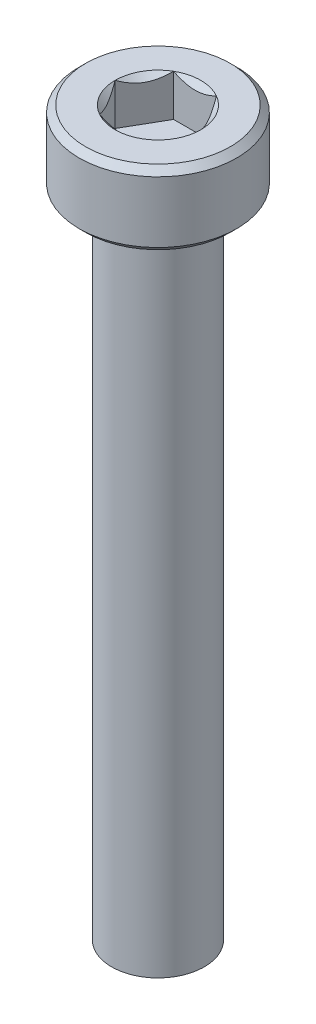
ISO-10303-21;
HEADER;
FILE_DESCRIPTION(('STEP AP214'),'2;1');
FILE_NAME('part.step','',(''),(''),'','','');
FILE_SCHEMA(('AUTOMOTIVE_DESIGN { 1 0 10303 214 1 1 1 1 }'));
ENDSEC;
DATA;
#1=APPLICATION_CONTEXT('core data for automotive mechanical design processes');
#2=APPLICATION_PROTOCOL_DEFINITION('international standard','automotive_design',2000,#1);
#3=PRODUCT_CONTEXT('',#1,'mechanical');
#4=PRODUCT('Part','Part','',(#3));
#5=PRODUCT_RELATED_PRODUCT_CATEGORY('part','',(#4));
#6=PRODUCT_DEFINITION_FORMATION('','',#4);
#7=PRODUCT_DEFINITION_CONTEXT('part definition',#1,'design');
#8=PRODUCT_DEFINITION('design','',#6,#7);
#9=PRODUCT_DEFINITION_SHAPE('','',#8);
#10=(LENGTH_UNIT() NAMED_UNIT(*) SI_UNIT(.MILLI.,.METRE.));
#11=(NAMED_UNIT(*) PLANE_ANGLE_UNIT() SI_UNIT($,.RADIAN.));
#12=(NAMED_UNIT(*) SI_UNIT($,.STERADIAN.) SOLID_ANGLE_UNIT());
#13=UNCERTAINTY_MEASURE_WITH_UNIT(LENGTH_MEASURE(1.E-05),#10,'distance_accuracy_value','');
#14=(GEOMETRIC_REPRESENTATION_CONTEXT(3) GLOBAL_UNCERTAINTY_ASSIGNED_CONTEXT((#13)) GLOBAL_UNIT_ASSIGNED_CONTEXT((#10,
#11,#12)) REPRESENTATION_CONTEXT('',''));
#15=CARTESIAN_POINT('',(0.,0.,0.));
#16=DIRECTION('',(0.,0.,1.));
#17=DIRECTION('',(1.,0.,0.));
#18=AXIS2_PLACEMENT_3D('',#15,#16,#17);
#19=CARTESIAN_POINT('',(0.,4.,0.));
#20=DIRECTION('',(0.,-1.,0.));
#21=DIRECTION('',(0.,0.,-1.));
#22=AXIS2_PLACEMENT_3D('',#19,#20,#21);
#23=CYLINDRICAL_SURFACE('',#22,4.25);
#24=CARTESIAN_POINT('',(0.,0.35,0.));
#25=DIRECTION('',(0.,1.,0.));
#26=DIRECTION('',(0.,0.,1.));
#27=AXIS2_PLACEMENT_3D('',#24,#25,#26);
#28=CIRCLE('',#27,4.25);
#29=CARTESIAN_POINT('',(0.,0.35,4.25));
#30=VERTEX_POINT('',#29);
#31=EDGE_CURVE('E191',#30,#30,#28,.T.);
#32=ORIENTED_EDGE('',*,*,#31,.T.);
#33=EDGE_LOOP('',(#32));
#34=FACE_BOUND('',#33,.T.);
#35=CARTESIAN_POINT('',(0.,3.65,0.));
#36=DIRECTION('',(0.,1.,0.));
#37=DIRECTION('',(0.,0.,1.));
#38=AXIS2_PLACEMENT_3D('',#35,#36,#37);
#39=CIRCLE('',#38,4.25);
#40=CARTESIAN_POINT('',(0.,3.65,4.25));
#41=VERTEX_POINT('',#40);
#42=EDGE_CURVE('E172',#41,#41,#39,.F.);
#43=ORIENTED_EDGE('',*,*,#42,.T.);
#44=EDGE_LOOP('',(#43));
#45=FACE_BOUND('',#44,.T.);
#46=ADVANCED_FACE('F33',(#34,#45),#23,.T.);
#47=CARTESIAN_POINT('',(0.,4.,0.));
#48=DIRECTION('',(0.,1.,0.));
#49=DIRECTION('',(0.,0.,1.));
#50=AXIS2_PLACEMENT_3D('',#47,#48,#49);
#51=PLANE('',#50);
#52=CARTESIAN_POINT('',(0.,4.,0.));
#53=DIRECTION('',(0.,1.,0.));
#54=DIRECTION('',(0.,0.,1.));
#55=AXIS2_PLACEMENT_3D('',#52,#53,#54);
#56=CIRCLE('',#55,3.9);
#57=CARTESIAN_POINT('',(0.,4.,3.9));
#58=VERTEX_POINT('',#57);
#59=EDGE_CURVE('E37',#58,#58,#56,.T.);
#60=ORIENTED_EDGE('',*,*,#59,.T.);
#61=EDGE_LOOP('',(#60));
#62=FACE_BOUND('',#61,.T.);
#63=CARTESIAN_POINT('',(0.,4.,0.));
#64=DIRECTION('',(0.,1.,0.));
#65=DIRECTION('',(0.,0.,1.));
#66=AXIS2_PLACEMENT_3D('',#63,#64,#65);
#67=CIRCLE('',#66,2.3094010767585);
#68=CARTESIAN_POINT('',(1.15470053837925,4.,2.));
#69=VERTEX_POINT('',#68);
#70=CARTESIAN_POINT('',(2.3094010767585,4.,0.));
#71=VERTEX_POINT('',#70);
#72=EDGE_CURVE('E48',#69,#71,#67,.T.);
#73=ORIENTED_EDGE('',*,*,#72,.F.);
#74=CARTESIAN_POINT('',(-1.15470053837925,4.,2.));
#75=VERTEX_POINT('',#74);
#76=EDGE_CURVE('E55',#75,#69,#67,.T.);
#77=ORIENTED_EDGE('',*,*,#76,.F.);
#78=CARTESIAN_POINT('',(-2.3094010767585,4.,0.));
#79=VERTEX_POINT('',#78);
#80=EDGE_CURVE('E220',#79,#75,#67,.T.);
#81=ORIENTED_EDGE('',*,*,#80,.F.);
#82=CARTESIAN_POINT('',(-1.15470053837925,4.,-2.));
#83=VERTEX_POINT('',#82);
#84=EDGE_CURVE('E270',#83,#79,#67,.T.);
#85=ORIENTED_EDGE('',*,*,#84,.F.);
#86=CARTESIAN_POINT('',(1.15470053837925,4.,-2.));
#87=VERTEX_POINT('',#86);
#88=EDGE_CURVE('E274',#87,#83,#67,.T.);
#89=ORIENTED_EDGE('',*,*,#88,.F.);
#90=EDGE_CURVE('E223',#71,#87,#67,.T.);
#91=ORIENTED_EDGE('',*,*,#90,.F.);
#92=EDGE_LOOP('',(#73,#77,#81,#85,#89,#91));
#93=FACE_BOUND('',#92,.T.);
#94=ADVANCED_FACE('F118',(#62,#93),#51,.T.);
#95=CARTESIAN_POINT('',(0.,0.,0.));
#96=DIRECTION('',(0.,1.,0.));
#97=DIRECTION('',(0.,0.,1.));
#98=AXIS2_PLACEMENT_3D('',#95,#96,#97);
#99=PLANE('',#98);
#100=CARTESIAN_POINT('',(0.,0.,0.));
#101=DIRECTION('',(0.,-1.,0.));
#102=DIRECTION('',(0.,0.,-1.));
#103=AXIS2_PLACEMENT_3D('',#100,#101,#102);
#104=CIRCLE('',#103,2.5);
#105=CARTESIAN_POINT('',(0.,0.,-2.5));
#106=VERTEX_POINT('',#105);
#107=EDGE_CURVE('E11',#106,#106,#104,.T.);
#108=ORIENTED_EDGE('',*,*,#107,.F.);
#109=EDGE_LOOP('',(#108));
#110=FACE_BOUND('',#109,.T.);
#111=CARTESIAN_POINT('',(0.,0.,0.));
#112=DIRECTION('',(0.,1.,0.));
#113=DIRECTION('',(0.,0.,1.));
#114=AXIS2_PLACEMENT_3D('',#111,#112,#113);
#115=CIRCLE('',#114,3.9);
#116=CARTESIAN_POINT('',(0.,0.,3.9));
#117=VERTEX_POINT('',#116);
#118=EDGE_CURVE('E192',#117,#117,#115,.F.);
#119=ORIENTED_EDGE('',*,*,#118,.T.);
#120=EDGE_LOOP('',(#119));
#121=FACE_BOUND('',#120,.T.);
#122=ADVANCED_FACE('F115',(#110,#121),#99,.F.);
#123=CARTESIAN_POINT('',(0.,4.,0.));
#124=DIRECTION('',(0.,1.,0.));
#125=DIRECTION('',(0.,0.,1.));
#126=AXIS2_PLACEMENT_3D('',#123,#124,#125);
#127=CONICAL_SURFACE('',#126,2.3094010767585,0.78539816339745);
#128=ORIENTED_EDGE('',*,*,#88,.T.);
#129=CARTESIAN_POINT('',(-2.30879514519547,4.7451913710941,-2.));
#130=CARTESIAN_POINT('',(-2.25260483420644,4.70272936243434,-2.));
#131=CARTESIAN_POINT('',(-2.19610054826954,4.66067688200341,-2.));
#132=CARTESIAN_POINT('',(-2.08233997644141,4.57757255324399,-2.));
#133=CARTESIAN_POINT('',(-2.02508350593089,4.53652095791472,-2.));
#134=CARTESIAN_POINT('',(-1.90927566541922,4.45530804643438,-2.));
#135=CARTESIAN_POINT('',(-1.85071770008489,4.41515609122241,-2.));
#136=CARTESIAN_POINT('',(-1.73260864093249,4.3363515847231,-2.));
#137=CARTESIAN_POINT('',(-1.67305761759535,4.29769892766731,-2.));
#138=CARTESIAN_POINT('',(-1.48577916730299,4.18010979954426,-2.));
#139=CARTESIAN_POINT('',(-1.35605368916015,4.10429897318513,-2.));
#140=CARTESIAN_POINT('',(-1.09012591699501,3.96558678933234,-2.));
#141=CARTESIAN_POINT('',(-0.953947448051695,3.90264190405374,-2.));
#142=CARTESIAN_POINT('',(-0.749595808101582,3.82563304479576,-2.));
#143=CARTESIAN_POINT('',(-0.68446185868507,3.80354078810321,-2.));
#144=CARTESIAN_POINT('',(-0.552616590705859,3.76458470124845,-2.));
#145=CARTESIAN_POINT('',(-0.485905164307167,3.74772122964342,-2.));
#146=CARTESIAN_POINT('',(-0.35242076182913,3.72038115809599,-2.));
#147=CARTESIAN_POINT('',(-0.285670630070522,3.70979477255778,-2.));
#148=CARTESIAN_POINT('',(-0.151450075115658,3.69521650264193,-2.));
#149=CARTESIAN_POINT('',(-0.0839797791079536,3.69122347258728,-2.));
#150=CARTESIAN_POINT('',(0.0485458836876959,3.69013056832569,-2.));
#151=CARTESIAN_POINT('',(0.113599297040325,3.69278385991794,-2.));
#152=CARTESIAN_POINT('',(0.243151501456514,3.7042913666304,-2.));
#153=CARTESIAN_POINT('',(0.307650238204749,3.71314618217543,-2.));
#154=CARTESIAN_POINT('',(0.436718068720302,3.73672255220297,-2.));
#155=CARTESIAN_POINT('',(0.501268607918767,3.75154414683371,-2.));
#156=CARTESIAN_POINT('',(0.62895874241765,3.78626456197787,-2.));
#157=CARTESIAN_POINT('',(0.692098453289582,3.80616296494129,-2.));
#158=CARTESIAN_POINT('',(0.890618825033236,3.87621951925558,-2.));
#159=CARTESIAN_POINT('',(1.02317938217928,3.9343452676672,-2.));
#160=CARTESIAN_POINT('',(1.28208571706617,4.06358808493712,-2.));
#161=CARTESIAN_POINT('',(1.40840705860453,4.1347517736225,-2.));
#162=CARTESIAN_POINT('',(1.59098608025607,4.245808104349,-2.));
#163=CARTESIAN_POINT('',(1.64922192266561,4.28251192905768,-2.));
#164=CARTESIAN_POINT('',(1.76469412690495,4.35747121364132,-2.));
#165=CARTESIAN_POINT('',(1.82193041260228,4.39572679097645,-2.));
#166=CARTESIAN_POINT('',(1.93507003138205,4.47318936346553,-2.));
#167=CARTESIAN_POINT('',(1.99098041312104,4.51238611495078,-2.));
#168=CARTESIAN_POINT('',(2.10203689890268,4.59181712257718,-2.));
#169=CARTESIAN_POINT('',(2.15718320893172,4.63205109038507,-2.));
#170=CARTESIAN_POINT('',(2.21200957179853,4.67270997847205,-2.));
#171=B_SPLINE_CURVE_WITH_KNOTS('',3,(#129,#130,#131,#132,#133,#134,#135,#136,#137,#138,#139,
#140,#141,#142,#143,#144,#145,#146,#147,#148,#149,#150,#151,#152,#153,#154,#155,#156,#157,#158,
#159,#160,#161,#162,#163,#164,#165,#166,#167,#168,#169,#170),.UNSPECIFIED.,.F.,.F.,(4,2,2,2,2,2,
2,2,2,2,2,2,2,2,2,2,2,2,2,2,4),(0.,0.211292968403538,0.422638804079875,0.635621962722851,
0.848590068976733,1.29896262331491,1.74778530247796,1.95394639565666,2.16012162294077,
2.36257550428405,2.56499420305935,2.76000764023076,2.95503996100237,3.15348829581996,
3.35192031420439,3.78488584147103,4.2194308621905,4.42592352930545,4.63243185619172,
4.83726388732872,5.04203957897375),.UNSPECIFIED.);
#172=EDGE_CURVE('E188',#87,#83,#171,.F.);
#173=ORIENTED_EDGE('',*,*,#172,.F.);
#174=EDGE_LOOP('',(#128,#173));
#175=FACE_BOUND('',#174,.T.);
#176=ADVANCED_FACE('F96',(#175),#127,.F.);
#177=ORIENTED_EDGE('',*,*,#84,.T.);
#178=CARTESIAN_POINT('',(-1.15458506832541,4.00011547871366,-2.0002));
#179=CARTESIAN_POINT('',(-1.19427965103065,3.96045309022559,-1.93144696596929));
#180=CARTESIAN_POINT('',(-1.23463799837204,3.92311998228416,-1.86154425786449));
#181=CARTESIAN_POINT('',(-1.31693321846145,3.85476368513614,-1.71900475544956));
#182=CARTESIAN_POINT('',(-1.35887791933134,3.82377853373722,-1.64635440243464));
#183=CARTESIAN_POINT('',(-1.44345742638069,3.77070021654414,-1.49985839894603));
#184=CARTESIAN_POINT('',(-1.48607068799507,3.74847362717661,-1.4260500647537));
#185=CARTESIAN_POINT('',(-1.57223542169503,3.71422881667508,-1.27680836816473));
#186=CARTESIAN_POINT('',(-1.61578426088223,3.70218502914413,-1.20137956608185));
#187=CARTESIAN_POINT('',(-1.69083694766536,3.69131851190557,-1.07138449932892));
#188=CARTESIAN_POINT('',(-1.72224381117151,3.68970975360997,-1.01698621602989));
#189=CARTESIAN_POINT('',(-1.78500621460364,3.69241887759871,-0.908278544480304));
#190=CARTESIAN_POINT('',(-1.81636173267754,3.69673883775797,-0.853969194078659));
#191=CARTESIAN_POINT('',(-1.87877671565355,3.71105956740991,-0.74586327241066));
#192=CARTESIAN_POINT('',(-1.90983580972306,3.72106669276201,-0.692067343445206));
#193=CARTESIAN_POINT('',(-1.97141691651548,3.74621243024966,-0.585405737694424));
#194=CARTESIAN_POINT('',(-2.00193897021859,3.76135064904224,-0.532539989929285));
#195=CARTESIAN_POINT('',(-2.08012358375727,3.80629450342919,-0.397120266910154));
#196=CARTESIAN_POINT('',(-2.12730124240478,3.83948883942582,-0.315406165150521));
#197=CARTESIAN_POINT('',(-2.19667172615922,3.89552582317137,-0.195252962742198));
#198=CARTESIAN_POINT('',(-2.21953238052245,3.91521470294694,-0.155657147890823));
#199=CARTESIAN_POINT('',(-2.26483018959123,3.95638731836487,-0.0771990411121286));
#200=CARTESIAN_POINT('',(-2.28726759416161,3.97786995165125,-0.0383363164062609));
#201=CARTESIAN_POINT('',(-2.30951654681234,4.00011547871366,0.000199999999998398));
#202=B_SPLINE_CURVE_WITH_KNOTS('',3,(#178,#179,#180,#181,#182,#183,#184,#185,#186,#187,#188,
#189,#190,#191,#192,#193,#194,#195,#196,#197,#198,#199,#200,#201),.UNSPECIFIED.,.F.,.F.,(4,2,2,
2,2,2,2,2,2,2,2,4),(0.,0.266420613771064,0.534393751523389,0.798110374376916,1.06116288956937,
1.24939906803722,1.43770123566248,1.62621426093932,1.81471283831913,2.11415604834145,
2.2634717071779,2.4126962696977),.UNSPECIFIED.);
#203=EDGE_CURVE('E229',#83,#79,#202,.T.);
#204=ORIENTED_EDGE('',*,*,#203,.F.);
#205=EDGE_LOOP('',(#177,#204));
#206=FACE_BOUND('',#205,.T.);
#207=ADVANCED_FACE('F114',(#206),#127,.F.);
#208=ORIENTED_EDGE('',*,*,#80,.T.);
#209=CARTESIAN_POINT('',(-2.30951654681234,4.00011547871366,-0.000200000000001262));
#210=CARTESIAN_POINT('',(-2.26982196410711,3.96045309022559,0.0685530340307045));
#211=CARTESIAN_POINT('',(-2.22946361676572,3.92311998228416,0.138455742135511));
#212=CARTESIAN_POINT('',(-2.1471683966763,3.85476368513614,0.280995244550435));
#213=CARTESIAN_POINT('',(-2.10522369580642,3.82377853373722,0.353645597565357));
#214=CARTESIAN_POINT('',(-2.02064418875706,3.77070021654414,0.50014160105397));
#215=CARTESIAN_POINT('',(-1.97803092714269,3.74847362717661,0.573949935246294));
#216=CARTESIAN_POINT('',(-1.89186619344273,3.71422881667508,0.723191631835263));
#217=CARTESIAN_POINT('',(-1.84831735425552,3.70218502914413,0.798620433918151));
#218=CARTESIAN_POINT('',(-1.7732646674724,3.69131851190557,0.928615500671078));
#219=CARTESIAN_POINT('',(-1.74185780396625,3.68970975360997,0.983013783970107));
#220=CARTESIAN_POINT('',(-1.67909540053412,3.69241887759871,1.09172145551969));
#221=CARTESIAN_POINT('',(-1.64773988246021,3.69673883775797,1.14603080592134));
#222=CARTESIAN_POINT('',(-1.5853248994842,3.7110595674099,1.25413672758934));
#223=CARTESIAN_POINT('',(-1.55426580541469,3.721066692762,1.30793265655479));
#224=CARTESIAN_POINT('',(-1.49268469862228,3.74621243024966,1.41459426230557));
#225=CARTESIAN_POINT('',(-1.46216264491917,3.76135064904224,1.46746001007071));
#226=CARTESIAN_POINT('',(-1.38397803138049,3.80629450342919,1.60287973308984));
#227=CARTESIAN_POINT('',(-1.33680037273297,3.83948883942582,1.68459383484948));
#228=CARTESIAN_POINT('',(-1.26742988897853,3.89552582317137,1.8047470372578));
#229=CARTESIAN_POINT('',(-1.24456923461531,3.91521470294694,1.84434285210918));
#230=CARTESIAN_POINT('',(-1.19927142554652,3.95638731836487,1.92280095888787));
#231=CARTESIAN_POINT('',(-1.17683402097614,3.97786995165125,1.96166368359374));
#232=CARTESIAN_POINT('',(-1.15458506832541,4.00011547871366,2.0002));
#233=B_SPLINE_CURVE_WITH_KNOTS('',3,(#209,#210,#211,#212,#213,#214,#215,#216,#217,#218,#219,
#220,#221,#222,#223,#224,#225,#226,#227,#228,#229,#230,#231,#232),.UNSPECIFIED.,.F.,.F.,(4,2,2,
2,2,2,2,2,2,2,2,4),(0.,0.266420613771064,0.534393751523389,0.798110374376915,1.06116288956936,
1.24939906803722,1.43770123566247,1.62621426093932,1.81471283831913,2.11415604834145,
2.26347170717791,2.41269626969771),.UNSPECIFIED.);
#234=EDGE_CURVE('E235',#79,#75,#233,.T.);
#235=ORIENTED_EDGE('',*,*,#234,.F.);
#236=EDGE_LOOP('',(#208,#235));
#237=FACE_BOUND('',#236,.T.);
#238=ADVANCED_FACE('F268',(#237),#127,.F.);
#239=ORIENTED_EDGE('',*,*,#76,.T.);
#240=CARTESIAN_POINT('',(-2.30879514519547,4.7451913710941,2.));
#241=CARTESIAN_POINT('',(-2.25260483420644,4.70272936243434,2.));
#242=CARTESIAN_POINT('',(-2.19610054826953,4.66067688200341,2.));
#243=CARTESIAN_POINT('',(-2.0823399764414,4.57757255324399,2.));
#244=CARTESIAN_POINT('',(-2.02508350593089,4.53652095791471,2.));
#245=CARTESIAN_POINT('',(-1.90927566541922,4.45530804643438,2.));
#246=CARTESIAN_POINT('',(-1.85071770008489,4.41515609122241,2.));
#247=CARTESIAN_POINT('',(-1.73260864093249,4.3363515847231,2.));
#248=CARTESIAN_POINT('',(-1.67305761759535,4.29769892766731,2.));
#249=CARTESIAN_POINT('',(-1.48577916730299,4.18010979954426,2.));
#250=CARTESIAN_POINT('',(-1.35605368916015,4.10429897318513,2.));
#251=CARTESIAN_POINT('',(-1.09012591699501,3.96558678933234,2.));
#252=CARTESIAN_POINT('',(-0.953947448051694,3.90264190405374,2.));
#253=CARTESIAN_POINT('',(-0.749595808101582,3.82563304479576,2.));
#254=CARTESIAN_POINT('',(-0.68446185868507,3.80354078810321,2.));
#255=CARTESIAN_POINT('',(-0.552616590705859,3.76458470124845,2.));
#256=CARTESIAN_POINT('',(-0.485905164307167,3.74772122964342,2.));
#257=CARTESIAN_POINT('',(-0.352420761829129,3.72038115809599,2.));
#258=CARTESIAN_POINT('',(-0.285670630070522,3.70979477255778,2.));
#259=CARTESIAN_POINT('',(-0.151450075115657,3.69521650264193,2.));
#260=CARTESIAN_POINT('',(-0.0839797791079529,3.69122347258728,2.));
#261=CARTESIAN_POINT('',(0.0485458836876966,3.69013056832569,2.));
#262=CARTESIAN_POINT('',(0.113599297040325,3.69278385991794,2.));
#263=CARTESIAN_POINT('',(0.243151501456515,3.7042913666304,2.));
#264=CARTESIAN_POINT('',(0.307650238204749,3.71314618217543,2.));
#265=CARTESIAN_POINT('',(0.436718068720302,3.73672255220297,2.));
#266=CARTESIAN_POINT('',(0.501268607918768,3.75154414683371,2.));
#267=CARTESIAN_POINT('',(0.62895874241765,3.78626456197787,2.));
#268=CARTESIAN_POINT('',(0.692098453289583,3.80616296494129,2.));
#269=CARTESIAN_POINT('',(0.890618825033236,3.87621951925558,2.));
#270=CARTESIAN_POINT('',(1.02317938217928,3.9343452676672,2.));
#271=CARTESIAN_POINT('',(1.28208571706617,4.06358808493712,2.));
#272=CARTESIAN_POINT('',(1.40840705860453,4.1347517736225,2.));
#273=CARTESIAN_POINT('',(1.59098608025607,4.24580810434899,2.));
#274=CARTESIAN_POINT('',(1.64922192266561,4.28251192905768,2.));
#275=CARTESIAN_POINT('',(1.76469412690495,4.35747121364132,2.));
#276=CARTESIAN_POINT('',(1.82193041260228,4.39572679097644,2.));
#277=CARTESIAN_POINT('',(1.93507003138205,4.47318936346553,2.));
#278=CARTESIAN_POINT('',(1.99098041312104,4.51238611495078,2.));
#279=CARTESIAN_POINT('',(2.10203689890268,4.59181712257718,2.));
#280=CARTESIAN_POINT('',(2.15718320893172,4.63205109038507,2.));
#281=CARTESIAN_POINT('',(2.21200957179853,4.67270997847205,2.));
#282=B_SPLINE_CURVE_WITH_KNOTS('',3,(#240,#241,#242,#243,#244,#245,#246,#247,#248,#249,#250,
#251,#252,#253,#254,#255,#256,#257,#258,#259,#260,#261,#262,#263,#264,#265,#266,#267,#268,#269,
#270,#271,#272,#273,#274,#275,#276,#277,#278,#279,#280,#281),.UNSPECIFIED.,.F.,.F.,(4,2,2,2,2,2,
2,2,2,2,2,2,2,2,2,2,2,2,2,2,4),(0.,0.211292968403538,0.422638804079876,0.63562196272285,
0.848590068976733,1.29896262331491,1.74778530247796,1.95394639565666,2.16012162294077,
2.36257550428405,2.56499420305935,2.76000764023076,2.95503996100237,3.15348829581996,
3.35192031420438,3.78488584147103,4.2194308621905,4.42592352930545,4.63243185619172,
4.83726388732871,5.04203957897375),.UNSPECIFIED.);
#283=EDGE_CURVE('E254',#75,#69,#282,.T.);
#284=ORIENTED_EDGE('',*,*,#283,.F.);
#285=EDGE_LOOP('',(#239,#284));
#286=FACE_BOUND('',#285,.T.);
#287=ADVANCED_FACE('F267',(#286),#127,.F.);
#288=ORIENTED_EDGE('',*,*,#72,.T.);
#289=CARTESIAN_POINT('',(1.15458506832541,4.00011547871366,2.0002));
#290=CARTESIAN_POINT('',(1.19427965103064,3.96045309022559,1.93144696596929));
#291=CARTESIAN_POINT('',(1.23463799837204,3.92311998228416,1.86154425786449));
#292=CARTESIAN_POINT('',(1.31693321846145,3.85476368513614,1.71900475544956));
#293=CARTESIAN_POINT('',(1.35887791933134,3.82377853373722,1.64635440243464));
#294=CARTESIAN_POINT('',(1.44345742638069,3.77070021654414,1.49985839894603));
#295=CARTESIAN_POINT('',(1.48607068799507,3.74847362717661,1.42605006475371));
#296=CARTESIAN_POINT('',(1.57223542169503,3.71422881667508,1.27680836816474));
#297=CARTESIAN_POINT('',(1.61578426088223,3.70218502914413,1.20137956608185));
#298=CARTESIAN_POINT('',(1.69083694766536,3.69131851190557,1.07138449932892));
#299=CARTESIAN_POINT('',(1.72224381117151,3.68970975360997,1.01698621602989));
#300=CARTESIAN_POINT('',(1.78500621460364,3.69241887759871,0.908278544480306));
#301=CARTESIAN_POINT('',(1.81636173267754,3.69673883775797,0.85396919407866));
#302=CARTESIAN_POINT('',(1.87877671565355,3.71105956740991,0.745863272410661));
#303=CARTESIAN_POINT('',(1.90983580972306,3.72106669276201,0.692067343445207));
#304=CARTESIAN_POINT('',(1.97141691651548,3.74621243024966,0.585405737694425));
#305=CARTESIAN_POINT('',(2.00193897021859,3.76135064904224,0.532539989929286));
#306=CARTESIAN_POINT('',(2.08012358375727,3.80629450342919,0.397120266910155));
#307=CARTESIAN_POINT('',(2.12730124240478,3.83948883942582,0.315406165150521));
#308=CARTESIAN_POINT('',(2.19667172615922,3.89552582317137,0.195252962742197));
#309=CARTESIAN_POINT('',(2.21953238052245,3.91521470294694,0.155657147890823));
#310=CARTESIAN_POINT('',(2.26483018959124,3.95638731836487,0.0771990411121278));
#311=CARTESIAN_POINT('',(2.28726759416161,3.97786995165125,0.0383363164062597));
#312=CARTESIAN_POINT('',(2.30951654681234,4.00011547871366,-0.000200000000000139));
#313=B_SPLINE_CURVE_WITH_KNOTS('',3,(#289,#290,#291,#292,#293,#294,#295,#296,#297,#298,#299,
#300,#301,#302,#303,#304,#305,#306,#307,#308,#309,#310,#311,#312),.UNSPECIFIED.,.F.,.F.,(4,2,2,
2,2,2,2,2,2,2,2,4),(0.,0.266420613771064,0.534393751523389,0.798110374376915,1.06116288956936,
1.24939906803722,1.43770123566248,1.62621426093932,1.81471283831913,2.11415604834145,
2.2634717071779,2.41269626969771),.UNSPECIFIED.);
#314=EDGE_CURVE('E145',#69,#71,#313,.T.);
#315=ORIENTED_EDGE('',*,*,#314,.F.);
#316=EDGE_LOOP('',(#288,#315));
#317=FACE_BOUND('',#316,.T.);
#318=ADVANCED_FACE('F111',(#317),#127,.F.);
#319=ORIENTED_EDGE('',*,*,#90,.T.);
#320=CARTESIAN_POINT('',(2.30951654681234,4.00011547871366,0.000199999999999522));
#321=CARTESIAN_POINT('',(2.26982196410711,3.96045309022559,-0.0685530340307061));
#322=CARTESIAN_POINT('',(2.22946361676572,3.92311998228416,-0.138455742135512));
#323=CARTESIAN_POINT('',(2.1471683966763,3.85476368513614,-0.280995244550437));
#324=CARTESIAN_POINT('',(2.10522369580642,3.82377853373722,-0.353645597565359));
#325=CARTESIAN_POINT('',(2.02064418875706,3.77070021654414,-0.500141601053972));
#326=CARTESIAN_POINT('',(1.97803092714269,3.74847362717661,-0.573949935246295));
#327=CARTESIAN_POINT('',(1.89186619344273,3.71422881667508,-0.723191631835264));
#328=CARTESIAN_POINT('',(1.84831735425552,3.70218502914413,-0.798620433918152));
#329=CARTESIAN_POINT('',(1.7732646674724,3.69131851190557,-0.928615500671079));
#330=CARTESIAN_POINT('',(1.74185780396625,3.68970975360997,-0.983013783970109));
#331=CARTESIAN_POINT('',(1.67909540053412,3.69241887759871,-1.09172145551969));
#332=CARTESIAN_POINT('',(1.64773988246021,3.69673883775797,-1.14603080592134));
#333=CARTESIAN_POINT('',(1.5853248994842,3.71105956740991,-1.25413672758934));
#334=CARTESIAN_POINT('',(1.55426580541469,3.72106669276201,-1.30793265655479));
#335=CARTESIAN_POINT('',(1.49268469862228,3.74621243024966,-1.41459426230557));
#336=CARTESIAN_POINT('',(1.46216264491917,3.76135064904224,-1.46746001007071));
#337=CARTESIAN_POINT('',(1.38397803138049,3.80629450342919,-1.60287973308984));
#338=CARTESIAN_POINT('',(1.33680037273297,3.83948883942582,-1.68459383484948));
#339=CARTESIAN_POINT('',(1.26742988897853,3.89552582317137,-1.8047470372578));
#340=CARTESIAN_POINT('',(1.24456923461531,3.91521470294694,-1.84434285210918));
#341=CARTESIAN_POINT('',(1.19927142554652,3.95638731836487,-1.92280095888787));
#342=CARTESIAN_POINT('',(1.17683402097614,3.97786995165125,-1.96166368359374));
#343=CARTESIAN_POINT('',(1.15458506832541,4.00011547871366,-2.0002));
#344=B_SPLINE_CURVE_WITH_KNOTS('',3,(#320,#321,#322,#323,#324,#325,#326,#327,#328,#329,#330,
#331,#332,#333,#334,#335,#336,#337,#338,#339,#340,#341,#342,#343),.UNSPECIFIED.,.F.,.F.,(4,2,2,
2,2,2,2,2,2,2,2,4),(0.,0.266420613771064,0.534393751523388,0.798110374376914,1.06116288956936,
1.24939906803722,1.43770123566247,1.62621426093932,1.81471283831913,2.11415604834145,
2.2634717071779,2.41269626969771),.UNSPECIFIED.);
#345=EDGE_CURVE('E137',#71,#87,#344,.T.);
#346=ORIENTED_EDGE('',*,*,#345,.F.);
#347=EDGE_LOOP('',(#319,#346));
#348=FACE_BOUND('',#347,.T.);
#349=ADVANCED_FACE('F95',(#348),#127,.F.);
#350=CARTESIAN_POINT('',(0.,1.75,0.));
#351=DIRECTION('',(0.,1.,0.));
#352=DIRECTION('',(0.,0.,1.));
#353=AXIS2_PLACEMENT_3D('',#350,#351,#352);
#354=PLANE('',#353);
#355=CARTESIAN_POINT('',(0.,1.75,0.));
#356=DIRECTION('',(0.,1.,0.));
#357=DIRECTION('',(0.,0.,1.));
#358=AXIS2_PLACEMENT_3D('',#355,#356,#357);
#359=CIRCLE('',#358,0.059401076758495);
#360=CARTESIAN_POINT('',(0.,1.75,0.059401076758495));
#361=VERTEX_POINT('',#360);
#362=EDGE_CURVE('E186',#361,#361,#359,.T.);
#363=ORIENTED_EDGE('',*,*,#362,.F.);
#364=EDGE_LOOP('',(#363));
#365=FACE_BOUND('',#364,.T.);
#366=DIRECTION('',(-0.5,0.,-0.866025403784439));
#367=VECTOR('',#366,1.);
#368=CARTESIAN_POINT('',(2.3094010767585,1.75,0.));
#369=LINE('',#368,#367);
#370=CARTESIAN_POINT('',(2.3094010767585,1.75,0.));
#371=VERTEX_POINT('',#370);
#372=CARTESIAN_POINT('',(1.15470053837925,1.75,-2.));
#373=VERTEX_POINT('',#372);
#374=EDGE_CURVE('E144',#371,#373,#369,.T.);
#375=ORIENTED_EDGE('',*,*,#374,.T.);
#376=DIRECTION('',(-1.,0.,0.));
#377=VECTOR('',#376,1.);
#378=CARTESIAN_POINT('',(1.15470053837925,1.75,-2.));
#379=LINE('',#378,#377);
#380=CARTESIAN_POINT('',(-1.15470053837925,1.75,-2.));
#381=VERTEX_POINT('',#380);
#382=EDGE_CURVE('E153',#373,#381,#379,.T.);
#383=ORIENTED_EDGE('',*,*,#382,.T.);
#384=DIRECTION('',(-0.5,0.,0.866025403784439));
#385=VECTOR('',#384,1.);
#386=CARTESIAN_POINT('',(-1.15470053837925,1.75,-2.));
#387=LINE('',#386,#385);
#388=CARTESIAN_POINT('',(-2.3094010767585,1.75,0.));
#389=VERTEX_POINT('',#388);
#390=EDGE_CURVE('E156',#381,#389,#387,.T.);
#391=ORIENTED_EDGE('',*,*,#390,.T.);
#392=DIRECTION('',(0.5,0.,0.866025403784439));
#393=VECTOR('',#392,1.);
#394=CARTESIAN_POINT('',(-2.3094010767585,1.75,0.));
#395=LINE('',#394,#393);
#396=CARTESIAN_POINT('',(-1.15470053837925,1.75,2.));
#397=VERTEX_POINT('',#396);
#398=EDGE_CURVE('E159',#389,#397,#395,.T.);
#399=ORIENTED_EDGE('',*,*,#398,.T.);
#400=DIRECTION('',(1.,0.,0.));
#401=VECTOR('',#400,1.);
#402=CARTESIAN_POINT('',(-1.15470053837925,1.75,2.));
#403=LINE('',#402,#401);
#404=CARTESIAN_POINT('',(1.15470053837925,1.75,2.));
#405=VERTEX_POINT('',#404);
#406=EDGE_CURVE('E162',#397,#405,#403,.T.);
#407=ORIENTED_EDGE('',*,*,#406,.T.);
#408=DIRECTION('',(0.5,0.,-0.866025403784439));
#409=VECTOR('',#408,1.);
#410=CARTESIAN_POINT('',(1.15470053837925,1.75,2.));
#411=LINE('',#410,#409);
#412=EDGE_CURVE('E165',#405,#371,#411,.T.);
#413=ORIENTED_EDGE('',*,*,#412,.T.);
#414=EDGE_LOOP('',(#375,#383,#391,#399,#407,#413));
#415=FACE_BOUND('',#414,.T.);
#416=ADVANCED_FACE('F110',(#365,#415),#354,.T.);
#417=CARTESIAN_POINT('',(1.15470053837925,1.75,-2.));
#418=DIRECTION('',(0.,0.,-1.));
#419=DIRECTION('',(-1.,0.,0.));
#420=AXIS2_PLACEMENT_3D('',#417,#418,#419);
#421=PLANE('',#420);
#422=DIRECTION('',(0.,1.,0.));
#423=VECTOR('',#422,1.);
#424=CARTESIAN_POINT('',(1.15470053837925,1.75,-2.));
#425=LINE('',#424,#423);
#426=EDGE_CURVE('E168',#373,#87,#425,.T.);
#427=ORIENTED_EDGE('',*,*,#426,.T.);
#428=ORIENTED_EDGE('',*,*,#172,.T.);
#429=DIRECTION('',(0.,1.,0.));
#430=VECTOR('',#429,1.);
#431=CARTESIAN_POINT('',(-1.15470053837925,1.75,-2.));
#432=LINE('',#431,#430);
#433=EDGE_CURVE('E181',#381,#83,#432,.T.);
#434=ORIENTED_EDGE('',*,*,#433,.F.);
#435=ORIENTED_EDGE('',*,*,#382,.F.);
#436=EDGE_LOOP('',(#427,#428,#434,#435));
#437=FACE_BOUND('',#436,.T.);
#438=ADVANCED_FACE('F133',(#437),#421,.F.);
#439=CARTESIAN_POINT('',(-1.15470053837925,1.75,-2.));
#440=DIRECTION('',(-0.866025403784439,0.,-0.5));
#441=DIRECTION('',(-0.5,0.,0.866025403784439));
#442=AXIS2_PLACEMENT_3D('',#439,#440,#441);
#443=PLANE('',#442);
#444=ORIENTED_EDGE('',*,*,#433,.T.);
#445=ORIENTED_EDGE('',*,*,#203,.T.);
#446=DIRECTION('',(0.,1.,0.));
#447=VECTOR('',#446,1.);
#448=CARTESIAN_POINT('',(-2.3094010767585,1.75,0.));
#449=LINE('',#448,#447);
#450=EDGE_CURVE('E178',#389,#79,#449,.T.);
#451=ORIENTED_EDGE('',*,*,#450,.F.);
#452=ORIENTED_EDGE('',*,*,#390,.F.);
#453=EDGE_LOOP('',(#444,#445,#451,#452));
#454=FACE_BOUND('',#453,.T.);
#455=ADVANCED_FACE('F240',(#454),#443,.F.);
#456=CARTESIAN_POINT('',(-2.3094010767585,1.75,0.));
#457=DIRECTION('',(-0.866025403784439,0.,0.5));
#458=DIRECTION('',(0.5,0.,0.866025403784439));
#459=AXIS2_PLACEMENT_3D('',#456,#457,#458);
#460=PLANE('',#459);
#461=ORIENTED_EDGE('',*,*,#450,.T.);
#462=ORIENTED_EDGE('',*,*,#234,.T.);
#463=DIRECTION('',(0.,1.,0.));
#464=VECTOR('',#463,1.);
#465=CARTESIAN_POINT('',(-1.15470053837925,1.75,2.));
#466=LINE('',#465,#464);
#467=EDGE_CURVE('E176',#397,#75,#466,.T.);
#468=ORIENTED_EDGE('',*,*,#467,.F.);
#469=ORIENTED_EDGE('',*,*,#398,.F.);
#470=EDGE_LOOP('',(#461,#462,#468,#469));
#471=FACE_BOUND('',#470,.T.);
#472=ADVANCED_FACE('F243',(#471),#460,.F.);
#473=CARTESIAN_POINT('',(-1.15470053837925,1.75,2.));
#474=DIRECTION('',(0.,0.,1.));
#475=DIRECTION('',(1.,0.,0.));
#476=AXIS2_PLACEMENT_3D('',#473,#474,#475);
#477=PLANE('',#476);
#478=ORIENTED_EDGE('',*,*,#467,.T.);
#479=ORIENTED_EDGE('',*,*,#283,.T.);
#480=DIRECTION('',(0.,1.,0.));
#481=VECTOR('',#480,1.);
#482=CARTESIAN_POINT('',(1.15470053837925,1.75,2.));
#483=LINE('',#482,#481);
#484=EDGE_CURVE('E173',#405,#69,#483,.T.);
#485=ORIENTED_EDGE('',*,*,#484,.F.);
#486=ORIENTED_EDGE('',*,*,#406,.F.);
#487=EDGE_LOOP('',(#478,#479,#485,#486));
#488=FACE_BOUND('',#487,.T.);
#489=ADVANCED_FACE('F248',(#488),#477,.F.);
#490=CARTESIAN_POINT('',(1.15470053837925,1.75,2.));
#491=DIRECTION('',(0.866025403784439,0.,0.5));
#492=DIRECTION('',(0.5,0.,-0.866025403784439));
#493=AXIS2_PLACEMENT_3D('',#490,#491,#492);
#494=PLANE('',#493);
#495=ORIENTED_EDGE('',*,*,#484,.T.);
#496=ORIENTED_EDGE('',*,*,#314,.T.);
#497=DIRECTION('',(0.,1.,0.));
#498=VECTOR('',#497,1.);
#499=CARTESIAN_POINT('',(2.3094010767585,1.75,0.));
#500=LINE('',#499,#498);
#501=EDGE_CURVE('E169',#371,#71,#500,.T.);
#502=ORIENTED_EDGE('',*,*,#501,.F.);
#503=ORIENTED_EDGE('',*,*,#412,.F.);
#504=EDGE_LOOP('',(#495,#496,#502,#503));
#505=FACE_BOUND('',#504,.T.);
#506=ADVANCED_FACE('F102',(#505),#494,.F.);
#507=CARTESIAN_POINT('',(2.3094010767585,1.75,0.));
#508=DIRECTION('',(0.866025403784439,0.,-0.5));
#509=DIRECTION('',(-0.5,0.,-0.866025403784439));
#510=AXIS2_PLACEMENT_3D('',#507,#508,#509);
#511=PLANE('',#510);
#512=ORIENTED_EDGE('',*,*,#501,.T.);
#513=ORIENTED_EDGE('',*,*,#345,.T.);
#514=ORIENTED_EDGE('',*,*,#426,.F.);
#515=ORIENTED_EDGE('',*,*,#374,.F.);
#516=EDGE_LOOP('',(#512,#513,#514,#515));
#517=FACE_BOUND('',#516,.T.);
#518=ADVANCED_FACE('F92',(#517),#511,.F.);
#519=ORIENTED_EDGE('',*,*,#362,.T.);
#520=EDGE_LOOP('',(#519));
#521=FACE_BOUND('',#520,.T.);
#522=CARTESIAN_POINT('',(0.,1.69059892324151,0.));
#523=VERTEX_POINT('',#522);
#524=VERTEX_LOOP('',#523);
#525=FACE_BOUND('',#524,.T.);
#526=ADVANCED_FACE('F89',(#521,#525),#127,.F.);
#527=CARTESIAN_POINT('',(0.,0.35,0.));
#528=DIRECTION('',(0.,1.,0.));
#529=DIRECTION('',(0.,0.,1.));
#530=AXIS2_PLACEMENT_3D('',#527,#528,#529);
#531=CONICAL_SURFACE('',#530,4.25,0.78539816339745);
#532=CARTESIAN_POINT('',(0.,0.,3.9));
#533=CARTESIAN_POINT('',(0.,0.00364583333333348,3.90364583333333));
#534=CARTESIAN_POINT('',(0.,0.00729166666666674,3.90729166666667));
#535=CARTESIAN_POINT('',(0.,0.0145833333333333,3.91458333333333));
#536=CARTESIAN_POINT('',(0.,0.0182291666666665,3.91822916666667));
#537=CARTESIAN_POINT('',(0.,0.0255208333333332,3.92552083333333));
#538=CARTESIAN_POINT('',(0.,0.0291666666666665,3.92916666666667));
#539=CARTESIAN_POINT('',(0.,0.0364583333333333,3.93645833333333));
#540=CARTESIAN_POINT('',(0.,0.0401041666666667,3.94010416666667));
#541=CARTESIAN_POINT('',(0.,0.0473958333333333,3.94739583333333));
#542=CARTESIAN_POINT('',(0.,0.0510416666666665,3.95104166666667));
#543=CARTESIAN_POINT('',(0.,0.0583333333333331,3.95833333333333));
#544=CARTESIAN_POINT('',(0.,0.0619791666666666,3.96197916666667));
#545=CARTESIAN_POINT('',(0.,0.0692708333333333,3.96927083333333));
#546=CARTESIAN_POINT('',(0.,0.0729166666666665,3.97291666666667));
#547=CARTESIAN_POINT('',(0.,0.0802083333333331,3.98020833333333));
#548=CARTESIAN_POINT('',(0.,0.0838541666666666,3.98385416666667));
#549=CARTESIAN_POINT('',(0.,0.0911458333333333,3.99114583333333));
#550=CARTESIAN_POINT('',(0.,0.0947916666666665,3.99479166666667));
#551=CARTESIAN_POINT('',(0.,0.102083333333333,4.00208333333333));
#552=CARTESIAN_POINT('',(0.,0.105729166666666,4.00572916666667));
#553=CARTESIAN_POINT('',(0.,0.113020833333333,4.01302083333333));
#554=CARTESIAN_POINT('',(0.,0.116666666666667,4.01666666666667));
#555=CARTESIAN_POINT('',(0.,0.123958333333333,4.02395833333333));
#556=CARTESIAN_POINT('',(0.,0.127604166666666,4.02760416666667));
#557=CARTESIAN_POINT('',(0.,0.134895833333333,4.03489583333333));
#558=CARTESIAN_POINT('',(0.,0.138541666666667,4.03854166666667));
#559=CARTESIAN_POINT('',(0.,0.145833333333333,4.04583333333333));
#560=CARTESIAN_POINT('',(0.,0.149479166666666,4.04947916666667));
#561=CARTESIAN_POINT('',(0.,0.156770833333333,4.05677083333333));
#562=CARTESIAN_POINT('',(0.,0.160416666666666,4.06041666666667));
#563=CARTESIAN_POINT('',(0.,0.167708333333333,4.06770833333333));
#564=CARTESIAN_POINT('',(0.,0.171354166666667,4.07135416666667));
#565=CARTESIAN_POINT('',(0.,0.178645833333333,4.07864583333333));
#566=CARTESIAN_POINT('',(0.,0.182291666666666,4.08229166666667));
#567=CARTESIAN_POINT('',(0.,0.189583333333333,4.08958333333333));
#568=CARTESIAN_POINT('',(0.,0.193229166666666,4.09322916666667));
#569=CARTESIAN_POINT('',(0.,0.200520833333333,4.10052083333333));
#570=CARTESIAN_POINT('',(0.,0.204166666666666,4.10416666666667));
#571=CARTESIAN_POINT('',(0.,0.211458333333333,4.11145833333333));
#572=CARTESIAN_POINT('',(0.,0.215104166666666,4.11510416666667));
#573=CARTESIAN_POINT('',(0.,0.222395833333333,4.12239583333333));
#574=CARTESIAN_POINT('',(0.,0.226041666666666,4.12604166666667));
#575=CARTESIAN_POINT('',(0.,0.233333333333333,4.13333333333333));
#576=CARTESIAN_POINT('',(0.,0.236979166666666,4.13697916666667));
#577=CARTESIAN_POINT('',(0.,0.244270833333333,4.14427083333333));
#578=CARTESIAN_POINT('',(0.,0.247916666666666,4.14791666666667));
#579=CARTESIAN_POINT('',(0.,0.255208333333333,4.15520833333333));
#580=CARTESIAN_POINT('',(0.,0.258854166666666,4.15885416666667));
#581=CARTESIAN_POINT('',(0.,0.266145833333333,4.16614583333333));
#582=CARTESIAN_POINT('',(0.,0.269791666666666,4.16979166666667));
#583=CARTESIAN_POINT('',(0.,0.277083333333333,4.17708333333333));
#584=CARTESIAN_POINT('',(0.,0.280729166666666,4.18072916666667));
#585=CARTESIAN_POINT('',(0.,0.288020833333333,4.18802083333333));
#586=CARTESIAN_POINT('',(0.,0.291666666666666,4.19166666666667));
#587=CARTESIAN_POINT('',(0.,0.298958333333333,4.19895833333333));
#588=CARTESIAN_POINT('',(0.,0.302604166666666,4.20260416666667));
#589=CARTESIAN_POINT('',(0.,0.309895833333333,4.20989583333333));
#590=CARTESIAN_POINT('',(0.,0.313541666666666,4.21354166666667));
#591=CARTESIAN_POINT('',(0.,0.320833333333333,4.22083333333333));
#592=CARTESIAN_POINT('',(0.,0.324479166666666,4.22447916666667));
#593=CARTESIAN_POINT('',(0.,0.331770833333333,4.23177083333333));
#594=CARTESIAN_POINT('',(0.,0.335416666666666,4.23541666666667));
#595=CARTESIAN_POINT('',(0.,0.342708333333333,4.24270833333333));
#596=CARTESIAN_POINT('',(0.,0.346354166666666,4.24635416666667));
#597=CARTESIAN_POINT('',(0.,0.35,4.25));
#598=B_SPLINE_CURVE_WITH_KNOTS('',3,(#532,#533,#534,#535,#536,#537,#538,#539,#540,#541,#542,
#543,#544,#545,#546,#547,#548,#549,#550,#551,#552,#553,#554,#555,#556,#557,#558,#559,#560,#561,
#562,#563,#564,#565,#566,#567,#568,#569,#570,#571,#572,#573,#574,#575,#576,#577,#578,#579,#580,
#581,#582,#583,#584,#585,#586,#587,#588,#589,#590,#591,#592,#593,#594,#595,#596,#597),
.UNSPECIFIED.,.F.,.F.,(4,2,2,2,2,2,2,2,2,2,2,2,2,2,2,2,2,2,2,2,2,2,2,2,2,2,2,2,2,2,2,2,4),(0.,
0.0154679608384555,0.0309359216769116,0.0464038825153671,0.0618718433538225,0.0773398041922786,
0.0928077650307341,0.10827572586919,0.123743686707646,0.139211647546102,0.154679608384557,
0.170147569223013,0.185615530061469,0.201083490899924,0.21655145173838,0.232019412576836,
0.247487373415291,0.262955334253747,0.278423295092203,0.293891255930659,0.309359216769114,
0.32482717760757,0.340295138446026,0.355763099284482,0.371231060122938,0.386699020961393,
0.402166981799849,0.417634942638305,0.43310290347676,0.448570864315216,0.464038825153672,
0.479506785992128,0.494974746830583),.UNSPECIFIED.);
#599=EDGE_CURVE('BSEAM91',#117,#30,#598,.T.);
#600=ORIENTED_EDGE('',*,*,#118,.F.);
#601=ORIENTED_EDGE('',*,*,#31,.F.);
#602=ORIENTED_EDGE('',*,*,#599,.T.);
#603=ORIENTED_EDGE('',*,*,#599,.F.);
#604=EDGE_LOOP('',(#600,#602,#601,#603));
#605=FACE_BOUND('',#604,.T.);
#606=ADVANCED_FACE('F91',(#605),#531,.T.);
#607=CARTESIAN_POINT('',(0.,4.,0.));
#608=DIRECTION('',(0.,-1.,0.));
#609=DIRECTION('',(0.,0.,-1.));
#610=AXIS2_PLACEMENT_3D('',#607,#608,#609);
#611=CONICAL_SURFACE('',#610,3.9,0.785398163397448);
#612=ORIENTED_EDGE('',*,*,#42,.F.);
#613=EDGE_LOOP('',(#612));
#614=FACE_BOUND('',#613,.T.);
#615=ORIENTED_EDGE('',*,*,#59,.F.);
#616=EDGE_LOOP('',(#615));
#617=FACE_BOUND('',#616,.T.);
#618=ADVANCED_FACE('F35',(#614,#617),#611,.T.);
#619=CARTESIAN_POINT('',(0.,-35.,0.));
#620=DIRECTION('',(0.,1.,0.));
#621=DIRECTION('',(0.,0.,1.));
#622=AXIS2_PLACEMENT_3D('',#619,#620,#621);
#623=CYLINDRICAL_SURFACE('',#622,2.5);
#624=CARTESIAN_POINT('',(0.,-35.,0.));
#625=DIRECTION('',(0.,-1.,0.));
#626=DIRECTION('',(0.,0.,-1.));
#627=AXIS2_PLACEMENT_3D('',#624,#625,#626);
#628=CIRCLE('',#627,2.5);
#629=CARTESIAN_POINT('',(0.,-35.,-2.5));
#630=VERTEX_POINT('',#629);
#631=EDGE_CURVE('E217',#630,#630,#628,.T.);
#632=ORIENTED_EDGE('',*,*,#631,.F.);
#633=EDGE_LOOP('',(#632));
#634=FACE_BOUND('',#633,.T.);
#635=ORIENTED_EDGE('',*,*,#107,.T.);
#636=EDGE_LOOP('',(#635));
#637=FACE_BOUND('',#636,.T.);
#638=ADVANCED_FACE('F201',(#634,#637),#623,.T.);
#639=CARTESIAN_POINT('',(0.,-35.,0.));
#640=DIRECTION('',(0.,-1.,0.));
#641=DIRECTION('',(0.,0.,-1.));
#642=AXIS2_PLACEMENT_3D('',#639,#640,#641);
#643=PLANE('',#642);
#644=ORIENTED_EDGE('',*,*,#631,.T.);
#645=EDGE_LOOP('',(#644));
#646=FACE_BOUND('',#645,.T.);
#647=ADVANCED_FACE('F206',(#646),#643,.T.);
#648=CLOSED_SHELL('',(#46,#94,#122,#176,#207,#238,#287,#318,#349,#416,#438,#455,#472,#489,#506,
#518,#526,#606,#618,#638,#647));
#649=MANIFOLD_SOLID_BREP('B2',#648);
#650=ADVANCED_BREP_SHAPE_REPRESENTATION('',(#18,#649),#14);
#651=SHAPE_DEFINITION_REPRESENTATION(#9,#650);
ENDSEC;
END-ISO-10303-21;
